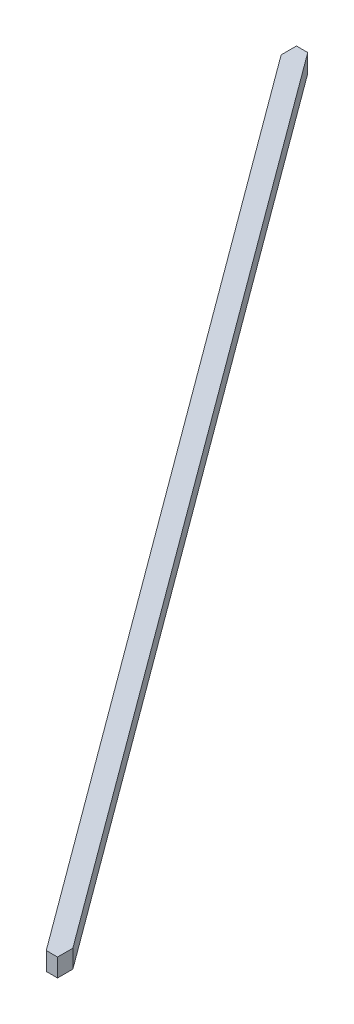
ISO-10303-21;
HEADER;
FILE_DESCRIPTION(('STEP AP214'),'2;1');
FILE_NAME('part.step','',(''),(''),'','','');
FILE_SCHEMA(('AUTOMOTIVE_DESIGN { 1 0 10303 214 1 1 1 1 }'));
ENDSEC;
DATA;
#1=APPLICATION_CONTEXT('core data for automotive mechanical design processes');
#2=APPLICATION_PROTOCOL_DEFINITION('international standard','automotive_design',2000,#1);
#3=PRODUCT_CONTEXT('',#1,'mechanical');
#4=PRODUCT('Part','Part','',(#3));
#5=PRODUCT_RELATED_PRODUCT_CATEGORY('part','',(#4));
#6=PRODUCT_DEFINITION_FORMATION('','',#4);
#7=PRODUCT_DEFINITION_CONTEXT('part definition',#1,'design');
#8=PRODUCT_DEFINITION('design','',#6,#7);
#9=PRODUCT_DEFINITION_SHAPE('','',#8);
#10=(LENGTH_UNIT() NAMED_UNIT(*) SI_UNIT(.MILLI.,.METRE.));
#11=(NAMED_UNIT(*) PLANE_ANGLE_UNIT() SI_UNIT($,.RADIAN.));
#12=(NAMED_UNIT(*) SI_UNIT($,.STERADIAN.) SOLID_ANGLE_UNIT());
#13=UNCERTAINTY_MEASURE_WITH_UNIT(LENGTH_MEASURE(1.E-05),#10,'distance_accuracy_value','');
#14=(GEOMETRIC_REPRESENTATION_CONTEXT(3) GLOBAL_UNCERTAINTY_ASSIGNED_CONTEXT((#13)) GLOBAL_UNIT_ASSIGNED_CONTEXT((#10,
#11,#12)) REPRESENTATION_CONTEXT('',''));
#15=CARTESIAN_POINT('',(0.,0.,0.));
#16=DIRECTION('',(0.,0.,1.));
#17=DIRECTION('',(1.,0.,0.));
#18=AXIS2_PLACEMENT_3D('',#15,#16,#17);
#19=CARTESIAN_POINT('',(0.,20.,-983.144592470832));
#20=DIRECTION('',(1.,0.,0.));
#21=DIRECTION('',(0.,0.,-1.));
#22=AXIS2_PLACEMENT_3D('',#19,#20,#21);
#23=PLANE('',#22);
#24=DIRECTION('',(0.,0.,1.));
#25=VECTOR('',#24,1.);
#26=CARTESIAN_POINT('',(0.,0.,-983.144592470832));
#27=LINE('',#26,#25);
#28=CARTESIAN_POINT('',(0.,0.,-1000.));
#29=VERTEX_POINT('',#28);
#30=CARTESIAN_POINT('',(0.,0.,-983.144592470832));
#31=VERTEX_POINT('',#30);
#32=EDGE_CURVE('E130',#29,#31,#27,.T.);
#33=ORIENTED_EDGE('',*,*,#32,.T.);
#34=DIRECTION('',(0.,-1.,0.));
#35=VECTOR('',#34,1.);
#36=CARTESIAN_POINT('',(0.,20.,-983.144592470832));
#37=LINE('',#36,#35);
#38=CARTESIAN_POINT('',(0.,20.,-983.144592470832));
#39=VERTEX_POINT('',#38);
#40=EDGE_CURVE('E11',#39,#31,#37,.T.);
#41=ORIENTED_EDGE('',*,*,#40,.F.);
#42=DIRECTION('',(0.,0.,1.));
#43=VECTOR('',#42,1.);
#44=CARTESIAN_POINT('',(0.,20.,-983.144592470832));
#45=LINE('',#44,#43);
#46=CARTESIAN_POINT('',(0.,20.,-1000.));
#47=VERTEX_POINT('',#46);
#48=EDGE_CURVE('E146',#47,#39,#45,.T.);
#49=ORIENTED_EDGE('',*,*,#48,.F.);
#50=DIRECTION('',(0.,-1.,0.));
#51=VECTOR('',#50,1.);
#52=CARTESIAN_POINT('',(0.,20.,-1000.));
#53=LINE('',#52,#51);
#54=EDGE_CURVE('E126',#47,#29,#53,.T.);
#55=ORIENTED_EDGE('',*,*,#54,.T.);
#56=EDGE_LOOP('',(#33,#41,#49,#55));
#57=FACE_BOUND('',#56,.T.);
#58=ADVANCED_FACE('F41',(#57),#23,.F.);
#59=CARTESIAN_POINT('',(724.577564651003,20.,0.));
#60=DIRECTION('',(0.804995133326071,0.,-0.593281413261314));
#61=DIRECTION('',(-0.593281413261314,0.,-0.804995133326071));
#62=AXIS2_PLACEMENT_3D('',#59,#60,#61);
#63=PLANE('',#62);
#64=DIRECTION('',(0.593281413261314,0.,0.80499513332607));
#65=VECTOR('',#64,1.);
#66=CARTESIAN_POINT('',(724.577564651003,0.,0.));
#67=LINE('',#66,#65);
#68=CARTESIAN_POINT('',(724.577564651003,0.,0.));
#69=VERTEX_POINT('',#68);
#70=EDGE_CURVE('E134',#31,#69,#67,.T.);
#71=ORIENTED_EDGE('',*,*,#70,.T.);
#72=DIRECTION('',(0.,-1.,0.));
#73=VECTOR('',#72,1.);
#74=CARTESIAN_POINT('',(724.577564651003,20.,0.));
#75=LINE('',#74,#73);
#76=CARTESIAN_POINT('',(724.577564651003,20.,0.));
#77=VERTEX_POINT('',#76);
#78=EDGE_CURVE('E50',#77,#69,#75,.T.);
#79=ORIENTED_EDGE('',*,*,#78,.F.);
#80=DIRECTION('',(0.593281413261314,0.,0.80499513332607));
#81=VECTOR('',#80,1.);
#82=CARTESIAN_POINT('',(724.577564651003,20.,0.));
#83=LINE('',#82,#81);
#84=EDGE_CURVE('E95',#39,#77,#83,.T.);
#85=ORIENTED_EDGE('',*,*,#84,.F.);
#86=ORIENTED_EDGE('',*,*,#40,.T.);
#87=EDGE_LOOP('',(#71,#79,#85,#86));
#88=FACE_BOUND('',#87,.T.);
#89=ADVANCED_FACE('F174',(#88),#63,.F.);
#90=CARTESIAN_POINT('',(737.,20.,0.));
#91=DIRECTION('',(0.,0.,-1.));
#92=DIRECTION('',(-1.,0.,0.));
#93=AXIS2_PLACEMENT_3D('',#90,#91,#92);
#94=PLANE('',#93);
#95=DIRECTION('',(1.,0.,0.));
#96=VECTOR('',#95,1.);
#97=CARTESIAN_POINT('',(737.,0.,0.));
#98=LINE('',#97,#96);
#99=CARTESIAN_POINT('',(737.,0.,0.));
#100=VERTEX_POINT('',#99);
#101=EDGE_CURVE('E137',#69,#100,#98,.T.);
#102=ORIENTED_EDGE('',*,*,#101,.T.);
#103=DIRECTION('',(0.,-1.,0.));
#104=VECTOR('',#103,1.);
#105=CARTESIAN_POINT('',(737.,20.,0.));
#106=LINE('',#105,#104);
#107=CARTESIAN_POINT('',(737.,20.,0.));
#108=VERTEX_POINT('',#107);
#109=EDGE_CURVE('E119',#108,#100,#106,.T.);
#110=ORIENTED_EDGE('',*,*,#109,.F.);
#111=DIRECTION('',(1.,0.,0.));
#112=VECTOR('',#111,1.);
#113=CARTESIAN_POINT('',(737.,20.,0.));
#114=LINE('',#113,#112);
#115=EDGE_CURVE('E108',#77,#108,#114,.T.);
#116=ORIENTED_EDGE('',*,*,#115,.F.);
#117=ORIENTED_EDGE('',*,*,#78,.T.);
#118=EDGE_LOOP('',(#102,#110,#116,#117));
#119=FACE_BOUND('',#118,.T.);
#120=ADVANCED_FACE('F156',(#119),#94,.F.);
#121=CARTESIAN_POINT('',(737.,20.,-16.8554075291679));
#122=DIRECTION('',(-1.,0.,0.));
#123=DIRECTION('',(0.,0.,1.));
#124=AXIS2_PLACEMENT_3D('',#121,#122,#123);
#125=PLANE('',#124);
#126=DIRECTION('',(0.,0.,-1.));
#127=VECTOR('',#126,1.);
#128=CARTESIAN_POINT('',(737.,0.,-16.8554075291679));
#129=LINE('',#128,#127);
#130=CARTESIAN_POINT('',(737.,0.,-16.8554075291679));
#131=VERTEX_POINT('',#130);
#132=EDGE_CURVE('E117',#100,#131,#129,.T.);
#133=ORIENTED_EDGE('',*,*,#132,.T.);
#134=DIRECTION('',(0.,-1.,0.));
#135=VECTOR('',#134,1.);
#136=CARTESIAN_POINT('',(737.,20.,-16.8554075291679));
#137=LINE('',#136,#135);
#138=CARTESIAN_POINT('',(737.,20.,-16.8554075291679));
#139=VERTEX_POINT('',#138);
#140=EDGE_CURVE('E114',#139,#131,#137,.T.);
#141=ORIENTED_EDGE('',*,*,#140,.F.);
#142=DIRECTION('',(0.,0.,-1.));
#143=VECTOR('',#142,1.);
#144=CARTESIAN_POINT('',(737.,20.,-16.8554075291679));
#145=LINE('',#144,#143);
#146=EDGE_CURVE('E102',#108,#139,#145,.T.);
#147=ORIENTED_EDGE('',*,*,#146,.F.);
#148=ORIENTED_EDGE('',*,*,#109,.T.);
#149=EDGE_LOOP('',(#133,#141,#147,#148));
#150=FACE_BOUND('',#149,.T.);
#151=ADVANCED_FACE('F115',(#150),#125,.F.);
#152=CARTESIAN_POINT('',(12.4224353489966,20.,-1000.));
#153=DIRECTION('',(-0.80499513332607,0.,0.593281413261314));
#154=DIRECTION('',(0.593281413261314,0.,0.80499513332607));
#155=AXIS2_PLACEMENT_3D('',#152,#153,#154);
#156=PLANE('',#155);
#157=DIRECTION('',(-0.593281413261314,0.,-0.80499513332607));
#158=VECTOR('',#157,1.);
#159=CARTESIAN_POINT('',(12.4224353489966,0.,-1000.));
#160=LINE('',#159,#158);
#161=CARTESIAN_POINT('',(12.4224353489966,0.,-1000.));
#162=VERTEX_POINT('',#161);
#163=EDGE_CURVE('E81',#131,#162,#160,.T.);
#164=ORIENTED_EDGE('',*,*,#163,.T.);
#165=DIRECTION('',(0.,-1.,0.));
#166=VECTOR('',#165,1.);
#167=CARTESIAN_POINT('',(12.4224353489966,20.,-1000.));
#168=LINE('',#167,#166);
#169=CARTESIAN_POINT('',(12.4224353489966,20.,-1000.));
#170=VERTEX_POINT('',#169);
#171=EDGE_CURVE('E120',#170,#162,#168,.T.);
#172=ORIENTED_EDGE('',*,*,#171,.F.);
#173=DIRECTION('',(-0.593281413261314,0.,-0.80499513332607));
#174=VECTOR('',#173,1.);
#175=CARTESIAN_POINT('',(12.4224353489966,20.,-1000.));
#176=LINE('',#175,#174);
#177=EDGE_CURVE('E106',#139,#170,#176,.T.);
#178=ORIENTED_EDGE('',*,*,#177,.F.);
#179=ORIENTED_EDGE('',*,*,#140,.T.);
#180=EDGE_LOOP('',(#164,#172,#178,#179));
#181=FACE_BOUND('',#180,.T.);
#182=ADVANCED_FACE('F122',(#181),#156,.F.);
#183=CARTESIAN_POINT('',(0.,20.,-1000.));
#184=DIRECTION('',(0.,0.,1.));
#185=DIRECTION('',(1.,0.,0.));
#186=AXIS2_PLACEMENT_3D('',#183,#184,#185);
#187=PLANE('',#186);
#188=DIRECTION('',(-1.,0.,0.));
#189=VECTOR('',#188,1.);
#190=CARTESIAN_POINT('',(0.,0.,-1000.));
#191=LINE('',#190,#189);
#192=EDGE_CURVE('E87',#162,#29,#191,.T.);
#193=ORIENTED_EDGE('',*,*,#192,.T.);
#194=ORIENTED_EDGE('',*,*,#54,.F.);
#195=DIRECTION('',(-1.,0.,0.));
#196=VECTOR('',#195,1.);
#197=CARTESIAN_POINT('',(0.,20.,-1000.));
#198=LINE('',#197,#196);
#199=EDGE_CURVE('E58',#170,#47,#198,.T.);
#200=ORIENTED_EDGE('',*,*,#199,.F.);
#201=ORIENTED_EDGE('',*,*,#171,.T.);
#202=EDGE_LOOP('',(#193,#194,#200,#201));
#203=FACE_BOUND('',#202,.T.);
#204=ADVANCED_FACE('F163',(#203),#187,.F.);
#205=CARTESIAN_POINT('',(0.,20.,0.));
#206=DIRECTION('',(0.,-1.,0.));
#207=DIRECTION('',(0.,0.,-1.));
#208=AXIS2_PLACEMENT_3D('',#205,#206,#207);
#209=PLANE('',#208);
#210=ORIENTED_EDGE('',*,*,#48,.T.);
#211=ORIENTED_EDGE('',*,*,#84,.T.);
#212=ORIENTED_EDGE('',*,*,#115,.T.);
#213=ORIENTED_EDGE('',*,*,#146,.T.);
#214=ORIENTED_EDGE('',*,*,#177,.T.);
#215=ORIENTED_EDGE('',*,*,#199,.T.);
#216=EDGE_LOOP('',(#210,#211,#212,#213,#214,#215));
#217=FACE_BOUND('',#216,.T.);
#218=ADVANCED_FACE('F104',(#217),#209,.F.);
#219=CARTESIAN_POINT('',(0.,0.,0.));
#220=DIRECTION('',(0.,-1.,0.));
#221=DIRECTION('',(0.,0.,-1.));
#222=AXIS2_PLACEMENT_3D('',#219,#220,#221);
#223=PLANE('',#222);
#224=ORIENTED_EDGE('',*,*,#32,.F.);
#225=ORIENTED_EDGE('',*,*,#192,.F.);
#226=ORIENTED_EDGE('',*,*,#163,.F.);
#227=ORIENTED_EDGE('',*,*,#132,.F.);
#228=ORIENTED_EDGE('',*,*,#101,.F.);
#229=ORIENTED_EDGE('',*,*,#70,.F.);
#230=EDGE_LOOP('',(#224,#225,#226,#227,#228,#229));
#231=FACE_BOUND('',#230,.T.);
#232=ADVANCED_FACE('F159',(#231),#223,.T.);
#233=CLOSED_SHELL('',(#58,#89,#120,#151,#182,#204,#218,#232));
#234=MANIFOLD_SOLID_BREP('B2',#233);
#235=ADVANCED_BREP_SHAPE_REPRESENTATION('',(#18,#234),#14);
#236=SHAPE_DEFINITION_REPRESENTATION(#9,#235);
ENDSEC;
END-ISO-10303-21;
